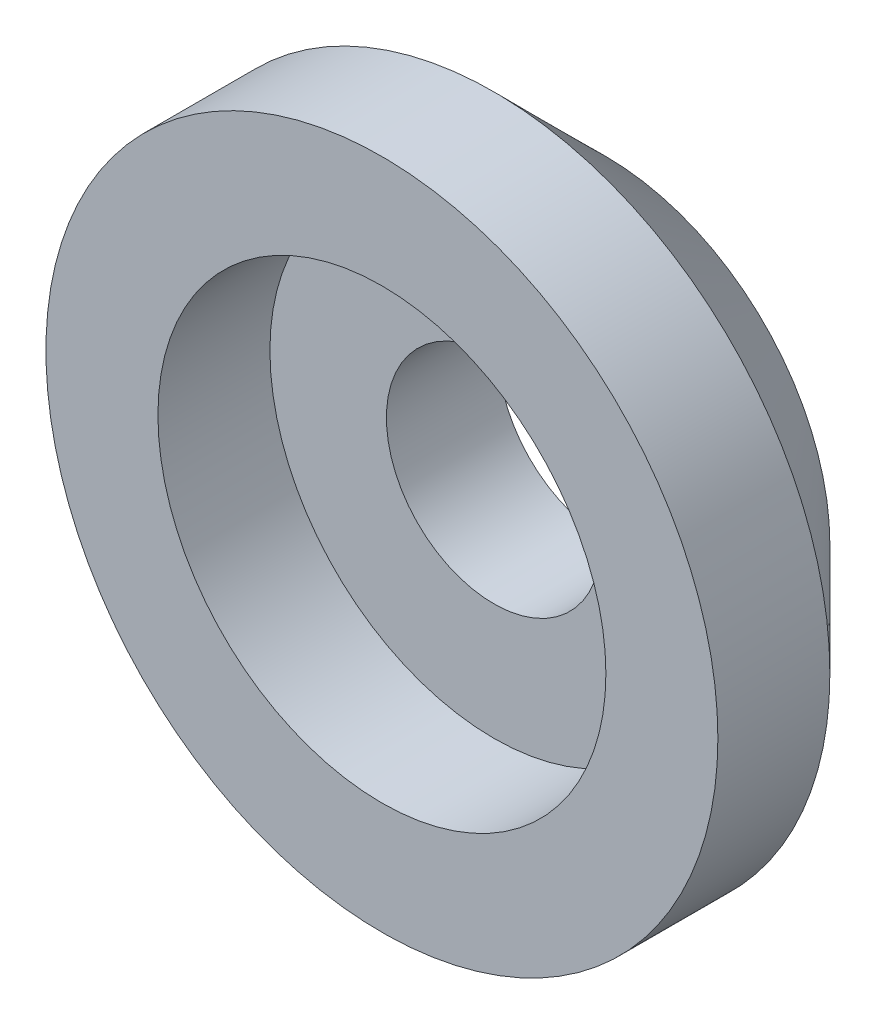
ISO-10303-21;
HEADER;
FILE_DESCRIPTION(('STEP AP214'),'2;1');
FILE_NAME('part.step','',(''),(''),'','','');
FILE_SCHEMA(('AUTOMOTIVE_DESIGN { 1 0 10303 214 1 1 1 1 }'));
ENDSEC;
DATA;
#1=APPLICATION_CONTEXT('core data for automotive mechanical design processes');
#2=APPLICATION_PROTOCOL_DEFINITION('international standard','automotive_design',2000,#1);
#3=PRODUCT_CONTEXT('',#1,'mechanical');
#4=PRODUCT('Part','Part','',(#3));
#5=PRODUCT_RELATED_PRODUCT_CATEGORY('part','',(#4));
#6=PRODUCT_DEFINITION_FORMATION('','',#4);
#7=PRODUCT_DEFINITION_CONTEXT('part definition',#1,'design');
#8=PRODUCT_DEFINITION('design','',#6,#7);
#9=PRODUCT_DEFINITION_SHAPE('','',#8);
#10=(LENGTH_UNIT() NAMED_UNIT(*) SI_UNIT(.MILLI.,.METRE.));
#11=(NAMED_UNIT(*) PLANE_ANGLE_UNIT() SI_UNIT($,.RADIAN.));
#12=(NAMED_UNIT(*) SI_UNIT($,.STERADIAN.) SOLID_ANGLE_UNIT());
#13=UNCERTAINTY_MEASURE_WITH_UNIT(LENGTH_MEASURE(1.E-05),#10,'distance_accuracy_value','');
#14=(GEOMETRIC_REPRESENTATION_CONTEXT(3) GLOBAL_UNCERTAINTY_ASSIGNED_CONTEXT((#13)) GLOBAL_UNIT_ASSIGNED_CONTEXT((#10,
#11,#12)) REPRESENTATION_CONTEXT('',''));
#15=CARTESIAN_POINT('',(0.,0.,0.));
#16=DIRECTION('',(0.,0.,1.));
#17=DIRECTION('',(1.,0.,0.));
#18=AXIS2_PLACEMENT_3D('',#15,#16,#17);
#19=CARTESIAN_POINT('',(0.,0.,5.));
#20=DIRECTION('',(0.,0.,-1.));
#21=DIRECTION('',(-1.,0.,0.));
#22=AXIS2_PLACEMENT_3D('',#19,#20,#21);
#23=CYLINDRICAL_SURFACE('',#22,7.5);
#24=CARTESIAN_POINT('',(0.,0.,2.5));
#25=DIRECTION('',(0.,0.,1.));
#26=DIRECTION('',(1.,0.,0.));
#27=AXIS2_PLACEMENT_3D('',#24,#25,#26);
#28=CIRCLE('',#27,7.5);
#29=CARTESIAN_POINT('',(7.5,0.,2.5));
#30=VERTEX_POINT('',#29);
#31=EDGE_CURVE('E48',#30,#30,#28,.T.);
#32=ORIENTED_EDGE('',*,*,#31,.T.);
#33=EDGE_LOOP('',(#32));
#34=FACE_BOUND('',#33,.T.);
#35=CARTESIAN_POINT('',(0.,0.,5.));
#36=DIRECTION('',(0.,0.,1.));
#37=DIRECTION('',(1.,0.,0.));
#38=AXIS2_PLACEMENT_3D('',#35,#36,#37);
#39=CIRCLE('',#38,7.5);
#40=CARTESIAN_POINT('',(7.5,0.,5.));
#41=VERTEX_POINT('',#40);
#42=EDGE_CURVE('E53',#41,#41,#39,.T.);
#43=ORIENTED_EDGE('',*,*,#42,.F.);
#44=EDGE_LOOP('',(#43));
#45=FACE_BOUND('',#44,.T.);
#46=ADVANCED_FACE('F39',(#34,#45),#23,.T.);
#47=CARTESIAN_POINT('',(0.,0.,5.));
#48=DIRECTION('',(0.,0.,1.));
#49=DIRECTION('',(1.,0.,0.));
#50=AXIS2_PLACEMENT_3D('',#47,#48,#49);
#51=PLANE('',#50);
#52=CARTESIAN_POINT('',(0.,0.,5.));
#53=DIRECTION('',(0.,0.,1.));
#54=DIRECTION('',(1.,0.,0.));
#55=AXIS2_PLACEMENT_3D('',#52,#53,#54);
#56=CIRCLE('',#55,5.);
#57=CARTESIAN_POINT('',(5.,0.,5.));
#58=VERTEX_POINT('',#57);
#59=EDGE_CURVE('E61',#58,#58,#56,.T.);
#60=ORIENTED_EDGE('',*,*,#59,.F.);
#61=EDGE_LOOP('',(#60));
#62=FACE_BOUND('',#61,.T.);
#63=ORIENTED_EDGE('',*,*,#42,.T.);
#64=EDGE_LOOP('',(#63));
#65=FACE_BOUND('',#64,.T.);
#66=ADVANCED_FACE('F97',(#62,#65),#51,.T.);
#67=CARTESIAN_POINT('',(0.,0.,0.));
#68=DIRECTION('',(0.,0.,1.));
#69=DIRECTION('',(1.,0.,0.));
#70=AXIS2_PLACEMENT_3D('',#67,#68,#69);
#71=PLANE('',#70);
#72=CARTESIAN_POINT('',(0.,0.,0.));
#73=DIRECTION('',(0.,0.,1.));
#74=DIRECTION('',(1.,0.,0.));
#75=AXIS2_PLACEMENT_3D('',#72,#73,#74);
#76=CIRCLE('',#75,2.4);
#77=CARTESIAN_POINT('',(2.4,0.,0.));
#78=VERTEX_POINT('',#77);
#79=EDGE_CURVE('E65',#78,#78,#76,.T.);
#80=ORIENTED_EDGE('',*,*,#79,.T.);
#81=EDGE_LOOP('',(#80));
#82=FACE_BOUND('',#81,.T.);
#83=CARTESIAN_POINT('',(0.,0.,0.));
#84=DIRECTION('',(0.,0.,1.));
#85=DIRECTION('',(1.,0.,0.));
#86=AXIS2_PLACEMENT_3D('',#83,#84,#85);
#87=CIRCLE('',#86,4.99999999999999);
#88=CARTESIAN_POINT('',(4.99999999999999,0.,0.));
#89=VERTEX_POINT('',#88);
#90=EDGE_CURVE('E10',#89,#89,#87,.F.);
#91=ORIENTED_EDGE('',*,*,#90,.T.);
#92=EDGE_LOOP('',(#91));
#93=FACE_BOUND('',#92,.T.);
#94=ADVANCED_FACE('F77',(#82,#93),#71,.F.);
#95=CARTESIAN_POINT('',(0.,0.,2.5));
#96=DIRECTION('',(0.,0.,1.));
#97=DIRECTION('',(1.,0.,0.));
#98=AXIS2_PLACEMENT_3D('',#95,#96,#97);
#99=CYLINDRICAL_SURFACE('',#98,5.);
#100=CARTESIAN_POINT('',(0.,0.,2.5));
#101=DIRECTION('',(0.,0.,1.));
#102=DIRECTION('',(1.,0.,0.));
#103=AXIS2_PLACEMENT_3D('',#100,#101,#102);
#104=CIRCLE('',#103,5.);
#105=CARTESIAN_POINT('',(5.,0.,2.5));
#106=VERTEX_POINT('',#105);
#107=EDGE_CURVE('E58',#106,#106,#104,.T.);
#108=ORIENTED_EDGE('',*,*,#107,.F.);
#109=EDGE_LOOP('',(#108));
#110=FACE_BOUND('',#109,.T.);
#111=ORIENTED_EDGE('',*,*,#59,.T.);
#112=EDGE_LOOP('',(#111));
#113=FACE_BOUND('',#112,.T.);
#114=ADVANCED_FACE('F88',(#110,#113),#99,.F.);
#115=CARTESIAN_POINT('',(0.,0.,2.5));
#116=DIRECTION('',(0.,0.,1.));
#117=DIRECTION('',(1.,0.,0.));
#118=AXIS2_PLACEMENT_3D('',#115,#116,#117);
#119=PLANE('',#118);
#120=CARTESIAN_POINT('',(0.,0.,2.5));
#121=DIRECTION('',(0.,0.,1.));
#122=DIRECTION('',(1.,0.,0.));
#123=AXIS2_PLACEMENT_3D('',#120,#121,#122);
#124=CIRCLE('',#123,2.4);
#125=CARTESIAN_POINT('',(2.4,0.,2.5));
#126=VERTEX_POINT('',#125);
#127=EDGE_CURVE('E69',#126,#126,#124,.T.);
#128=ORIENTED_EDGE('',*,*,#127,.F.);
#129=EDGE_LOOP('',(#128));
#130=FACE_BOUND('',#129,.T.);
#131=ORIENTED_EDGE('',*,*,#107,.T.);
#132=EDGE_LOOP('',(#131));
#133=FACE_BOUND('',#132,.T.);
#134=ADVANCED_FACE('F85',(#130,#133),#119,.T.);
#135=CARTESIAN_POINT('',(0.,0.,2.5));
#136=DIRECTION('',(0.,0.,1.));
#137=DIRECTION('',(1.,0.,0.));
#138=AXIS2_PLACEMENT_3D('',#135,#136,#137);
#139=CONICAL_SURFACE('',#138,7.5,0.78539816339745);
#140=ORIENTED_EDGE('',*,*,#90,.F.);
#141=EDGE_LOOP('',(#140));
#142=FACE_BOUND('',#141,.T.);
#143=ORIENTED_EDGE('',*,*,#31,.F.);
#144=EDGE_LOOP('',(#143));
#145=FACE_BOUND('',#144,.T.);
#146=ADVANCED_FACE('F42',(#142,#145),#139,.T.);
#147=CARTESIAN_POINT('',(0.,0.,0.));
#148=DIRECTION('',(0.,0.,1.));
#149=DIRECTION('',(1.,0.,0.));
#150=AXIS2_PLACEMENT_3D('',#147,#148,#149);
#151=CYLINDRICAL_SURFACE('',#150,2.4);
#152=ORIENTED_EDGE('',*,*,#79,.F.);
#153=EDGE_LOOP('',(#152));
#154=FACE_BOUND('',#153,.T.);
#155=ORIENTED_EDGE('',*,*,#127,.T.);
#156=EDGE_LOOP('',(#155));
#157=FACE_BOUND('',#156,.T.);
#158=ADVANCED_FACE('F79',(#154,#157),#151,.F.);
#159=CLOSED_SHELL('',(#46,#66,#94,#114,#134,#146,#158));
#160=MANIFOLD_SOLID_BREP('B2',#159);
#161=ADVANCED_BREP_SHAPE_REPRESENTATION('',(#18,#160),#14);
#162=SHAPE_DEFINITION_REPRESENTATION(#9,#161);
ENDSEC;
END-ISO-10303-21;
